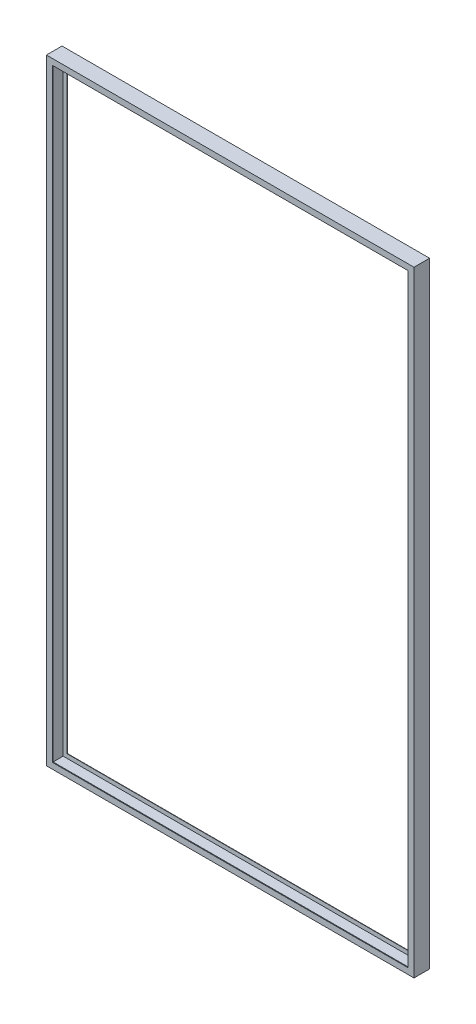
ISO-10303-21;
HEADER;
FILE_DESCRIPTION(('STEP AP214'),'2;1');
FILE_NAME('part.step','',(''),(''),'','','');
FILE_SCHEMA(('AUTOMOTIVE_DESIGN { 1 0 10303 214 1 1 1 1 }'));
ENDSEC;
DATA;
#1=APPLICATION_CONTEXT('core data for automotive mechanical design processes');
#2=APPLICATION_PROTOCOL_DEFINITION('international standard','automotive_design',2000,#1);
#3=PRODUCT_CONTEXT('',#1,'mechanical');
#4=PRODUCT('Part','Part','',(#3));
#5=PRODUCT_RELATED_PRODUCT_CATEGORY('part','',(#4));
#6=PRODUCT_DEFINITION_FORMATION('','',#4);
#7=PRODUCT_DEFINITION_CONTEXT('part definition',#1,'design');
#8=PRODUCT_DEFINITION('design','',#6,#7);
#9=PRODUCT_DEFINITION_SHAPE('','',#8);
#10=(LENGTH_UNIT() NAMED_UNIT(*) SI_UNIT(.MILLI.,.METRE.));
#11=(NAMED_UNIT(*) PLANE_ANGLE_UNIT() SI_UNIT($,.RADIAN.));
#12=(NAMED_UNIT(*) SI_UNIT($,.STERADIAN.) SOLID_ANGLE_UNIT());
#13=UNCERTAINTY_MEASURE_WITH_UNIT(LENGTH_MEASURE(1.E-05),#10,'distance_accuracy_value','');
#14=(GEOMETRIC_REPRESENTATION_CONTEXT(3) GLOBAL_UNCERTAINTY_ASSIGNED_CONTEXT((#13)) GLOBAL_UNIT_ASSIGNED_CONTEXT((#10,
#11,#12)) REPRESENTATION_CONTEXT('',''));
#15=CARTESIAN_POINT('',(0.,0.,0.));
#16=DIRECTION('',(0.,0.,1.));
#17=DIRECTION('',(1.,0.,0.));
#18=AXIS2_PLACEMENT_3D('',#15,#16,#17);
#19=CARTESIAN_POINT('',(979.,1647.,0.));
#20=DIRECTION('',(0.,1.,0.));
#21=DIRECTION('',(0.,0.,1.));
#22=AXIS2_PLACEMENT_3D('',#19,#20,#21);
#23=PLANE('',#22);
#24=DIRECTION('',(0.,0.,1.));
#25=VECTOR('',#24,1.);
#26=CARTESIAN_POINT('',(11.,1647.,0.));
#27=LINE('',#26,#25);
#28=CARTESIAN_POINT('',(11.,1647.,3.));
#29=VERTEX_POINT('',#28);
#30=CARTESIAN_POINT('',(11.,1647.,4.));
#31=VERTEX_POINT('',#30);
#32=EDGE_CURVE('E362',#29,#31,#27,.T.);
#33=ORIENTED_EDGE('',*,*,#32,.F.);
#34=DIRECTION('',(1.,0.,0.));
#35=VECTOR('',#34,1.);
#36=CARTESIAN_POINT('',(979.,1647.,3.));
#37=LINE('',#36,#35);
#38=CARTESIAN_POINT('',(979.,1647.,3.));
#39=VERTEX_POINT('',#38);
#40=EDGE_CURVE('E11',#29,#39,#37,.T.);
#41=ORIENTED_EDGE('',*,*,#40,.T.);
#42=DIRECTION('',(0.,0.,1.));
#43=VECTOR('',#42,1.);
#44=CARTESIAN_POINT('',(979.,1647.,0.));
#45=LINE('',#44,#43);
#46=CARTESIAN_POINT('',(979.,1647.,4.));
#47=VERTEX_POINT('',#46);
#48=EDGE_CURVE('E349',#39,#47,#45,.T.);
#49=ORIENTED_EDGE('',*,*,#48,.T.);
#50=DIRECTION('',(-1.,0.,0.));
#51=VECTOR('',#50,1.);
#52=CARTESIAN_POINT('',(979.,1647.,4.));
#53=LINE('',#52,#51);
#54=EDGE_CURVE('E273',#47,#31,#53,.T.);
#55=ORIENTED_EDGE('',*,*,#54,.T.);
#56=EDGE_LOOP('',(#33,#41,#49,#55));
#57=FACE_BOUND('',#56,.T.);
#58=ADVANCED_FACE('F40',(#57),#23,.F.);
#59=CARTESIAN_POINT('',(979.,11.,0.));
#60=DIRECTION('',(1.,0.,0.));
#61=DIRECTION('',(0.,0.,-1.));
#62=AXIS2_PLACEMENT_3D('',#59,#60,#61);
#63=PLANE('',#62);
#64=ORIENTED_EDGE('',*,*,#48,.F.);
#65=DIRECTION('',(0.,-1.,0.));
#66=VECTOR('',#65,1.);
#67=CARTESIAN_POINT('',(979.,11.,3.));
#68=LINE('',#67,#66);
#69=CARTESIAN_POINT('',(979.,11.,3.));
#70=VERTEX_POINT('',#69);
#71=EDGE_CURVE('E463',#39,#70,#68,.T.);
#72=ORIENTED_EDGE('',*,*,#71,.T.);
#73=DIRECTION('',(0.,0.,1.));
#74=VECTOR('',#73,1.);
#75=CARTESIAN_POINT('',(979.,11.,0.));
#76=LINE('',#75,#74);
#77=CARTESIAN_POINT('',(979.,11.,4.));
#78=VERTEX_POINT('',#77);
#79=EDGE_CURVE('E354',#70,#78,#76,.T.);
#80=ORIENTED_EDGE('',*,*,#79,.T.);
#81=DIRECTION('',(0.,1.,0.));
#82=VECTOR('',#81,1.);
#83=CARTESIAN_POINT('',(979.,11.,4.));
#84=LINE('',#83,#82);
#85=EDGE_CURVE('E269',#78,#47,#84,.T.);
#86=ORIENTED_EDGE('',*,*,#85,.T.);
#87=EDGE_LOOP('',(#64,#72,#80,#86));
#88=FACE_BOUND('',#87,.T.);
#89=ADVANCED_FACE('F519',(#88),#63,.F.);
#90=CARTESIAN_POINT('',(11.,11.,0.));
#91=DIRECTION('',(0.,-1.,0.));
#92=DIRECTION('',(0.,0.,-1.));
#93=AXIS2_PLACEMENT_3D('',#90,#91,#92);
#94=PLANE('',#93);
#95=ORIENTED_EDGE('',*,*,#79,.F.);
#96=DIRECTION('',(-1.,0.,0.));
#97=VECTOR('',#96,1.);
#98=CARTESIAN_POINT('',(11.,11.,3.));
#99=LINE('',#98,#97);
#100=CARTESIAN_POINT('',(11.,11.,3.));
#101=VERTEX_POINT('',#100);
#102=EDGE_CURVE('E66',#70,#101,#99,.T.);
#103=ORIENTED_EDGE('',*,*,#102,.T.);
#104=DIRECTION('',(0.,0.,1.));
#105=VECTOR('',#104,1.);
#106=CARTESIAN_POINT('',(11.,11.,0.));
#107=LINE('',#106,#105);
#108=CARTESIAN_POINT('',(11.,11.,4.));
#109=VERTEX_POINT('',#108);
#110=EDGE_CURVE('E358',#101,#109,#107,.T.);
#111=ORIENTED_EDGE('',*,*,#110,.T.);
#112=DIRECTION('',(1.,0.,0.));
#113=VECTOR('',#112,1.);
#114=CARTESIAN_POINT('',(11.,11.,4.));
#115=LINE('',#114,#113);
#116=EDGE_CURVE('E265',#109,#78,#115,.T.);
#117=ORIENTED_EDGE('',*,*,#116,.T.);
#118=EDGE_LOOP('',(#95,#103,#111,#117));
#119=FACE_BOUND('',#118,.T.);
#120=ADVANCED_FACE('F526',(#119),#94,.F.);
#121=CARTESIAN_POINT('',(11.,1647.,0.));
#122=DIRECTION('',(-1.,0.,0.));
#123=DIRECTION('',(0.,0.,1.));
#124=AXIS2_PLACEMENT_3D('',#121,#122,#123);
#125=PLANE('',#124);
#126=ORIENTED_EDGE('',*,*,#110,.F.);
#127=DIRECTION('',(0.,1.,0.));
#128=VECTOR('',#127,1.);
#129=CARTESIAN_POINT('',(11.,1647.,3.));
#130=LINE('',#129,#128);
#131=EDGE_CURVE('E51',#101,#29,#130,.T.);
#132=ORIENTED_EDGE('',*,*,#131,.T.);
#133=ORIENTED_EDGE('',*,*,#32,.T.);
#134=DIRECTION('',(0.,-1.,0.));
#135=VECTOR('',#134,1.);
#136=CARTESIAN_POINT('',(11.,1647.,4.));
#137=LINE('',#136,#135);
#138=EDGE_CURVE('E446',#31,#109,#137,.T.);
#139=ORIENTED_EDGE('',*,*,#138,.T.);
#140=EDGE_LOOP('',(#126,#132,#133,#139));
#141=FACE_BOUND('',#140,.T.);
#142=ADVANCED_FACE('F680',(#141),#125,.F.);
#143=CARTESIAN_POINT('',(0.,0.,42.));
#144=DIRECTION('',(1.,0.,0.));
#145=DIRECTION('',(0.,0.,-1.));
#146=AXIS2_PLACEMENT_3D('',#143,#144,#145);
#147=PLANE('',#146);
#148=DIRECTION('',(0.,-1.,0.));
#149=VECTOR('',#148,1.);
#150=CARTESIAN_POINT('',(0.,0.,0.));
#151=LINE('',#150,#149);
#152=CARTESIAN_POINT('',(0.,1658.,0.));
#153=VERTEX_POINT('',#152);
#154=CARTESIAN_POINT('',(0.,0.,0.));
#155=VERTEX_POINT('',#154);
#156=EDGE_CURVE('E395',#153,#155,#151,.T.);
#157=ORIENTED_EDGE('',*,*,#156,.T.);
#158=DIRECTION('',(0.,0.,-1.));
#159=VECTOR('',#158,1.);
#160=CARTESIAN_POINT('',(0.,0.,42.));
#161=LINE('',#160,#159);
#162=CARTESIAN_POINT('',(0.,0.,42.));
#163=VERTEX_POINT('',#162);
#164=EDGE_CURVE('E442',#163,#155,#161,.T.);
#165=ORIENTED_EDGE('',*,*,#164,.F.);
#166=DIRECTION('',(0.,-1.,0.));
#167=VECTOR('',#166,1.);
#168=CARTESIAN_POINT('',(0.,0.,42.));
#169=LINE('',#168,#167);
#170=CARTESIAN_POINT('',(0.,1658.,42.));
#171=VERTEX_POINT('',#170);
#172=EDGE_CURVE('E405',#171,#163,#169,.T.);
#173=ORIENTED_EDGE('',*,*,#172,.F.);
#174=DIRECTION('',(0.,0.,-1.));
#175=VECTOR('',#174,1.);
#176=CARTESIAN_POINT('',(0.,1658.,42.));
#177=LINE('',#176,#175);
#178=EDGE_CURVE('E419',#171,#153,#177,.T.);
#179=ORIENTED_EDGE('',*,*,#178,.T.);
#180=EDGE_LOOP('',(#157,#165,#173,#179));
#181=FACE_BOUND('',#180,.T.);
#182=ADVANCED_FACE('F684',(#181),#147,.F.);
#183=CARTESIAN_POINT('',(0.,0.,42.));
#184=DIRECTION('',(0.,1.,0.));
#185=DIRECTION('',(0.,0.,1.));
#186=AXIS2_PLACEMENT_3D('',#183,#184,#185);
#187=PLANE('',#186);
#188=DIRECTION('',(1.,0.,0.));
#189=VECTOR('',#188,1.);
#190=CARTESIAN_POINT('',(0.,0.,0.));
#191=LINE('',#190,#189);
#192=CARTESIAN_POINT('',(990.,0.,0.));
#193=VERTEX_POINT('',#192);
#194=EDGE_CURVE('E423',#155,#193,#191,.T.);
#195=ORIENTED_EDGE('',*,*,#194,.T.);
#196=DIRECTION('',(0.,0.,-1.));
#197=VECTOR('',#196,1.);
#198=CARTESIAN_POINT('',(990.,0.,42.));
#199=LINE('',#198,#197);
#200=CARTESIAN_POINT('',(990.,0.,42.));
#201=VERTEX_POINT('',#200);
#202=EDGE_CURVE('E438',#201,#193,#199,.T.);
#203=ORIENTED_EDGE('',*,*,#202,.F.);
#204=DIRECTION('',(1.,0.,0.));
#205=VECTOR('',#204,1.);
#206=CARTESIAN_POINT('',(0.,0.,42.));
#207=LINE('',#206,#205);
#208=EDGE_CURVE('E409',#163,#201,#207,.T.);
#209=ORIENTED_EDGE('',*,*,#208,.F.);
#210=ORIENTED_EDGE('',*,*,#164,.T.);
#211=EDGE_LOOP('',(#195,#203,#209,#210));
#212=FACE_BOUND('',#211,.T.);
#213=ADVANCED_FACE('F689',(#212),#187,.F.);
#214=CARTESIAN_POINT('',(990.,0.,42.));
#215=DIRECTION('',(-1.,0.,0.));
#216=DIRECTION('',(0.,0.,1.));
#217=AXIS2_PLACEMENT_3D('',#214,#215,#216);
#218=PLANE('',#217);
#219=DIRECTION('',(0.,1.,0.));
#220=VECTOR('',#219,1.);
#221=CARTESIAN_POINT('',(990.,0.,0.));
#222=LINE('',#221,#220);
#223=CARTESIAN_POINT('',(990.,1658.,0.));
#224=VERTEX_POINT('',#223);
#225=EDGE_CURVE('E426',#193,#224,#222,.T.);
#226=ORIENTED_EDGE('',*,*,#225,.T.);
#227=DIRECTION('',(0.,0.,-1.));
#228=VECTOR('',#227,1.);
#229=CARTESIAN_POINT('',(990.,1658.,42.));
#230=LINE('',#229,#228);
#231=CARTESIAN_POINT('',(990.,1658.,42.));
#232=VERTEX_POINT('',#231);
#233=EDGE_CURVE('E434',#232,#224,#230,.T.);
#234=ORIENTED_EDGE('',*,*,#233,.F.);
#235=DIRECTION('',(0.,1.,0.));
#236=VECTOR('',#235,1.);
#237=CARTESIAN_POINT('',(990.,0.,42.));
#238=LINE('',#237,#236);
#239=EDGE_CURVE('E413',#201,#232,#238,.T.);
#240=ORIENTED_EDGE('',*,*,#239,.F.);
#241=ORIENTED_EDGE('',*,*,#202,.T.);
#242=EDGE_LOOP('',(#226,#234,#240,#241));
#243=FACE_BOUND('',#242,.T.);
#244=ADVANCED_FACE('F724',(#243),#218,.F.);
#245=CARTESIAN_POINT('',(0.,1658.,42.));
#246=DIRECTION('',(0.,-1.,0.));
#247=DIRECTION('',(0.,0.,-1.));
#248=AXIS2_PLACEMENT_3D('',#245,#246,#247);
#249=PLANE('',#248);
#250=DIRECTION('',(-1.,0.,0.));
#251=VECTOR('',#250,1.);
#252=CARTESIAN_POINT('',(0.,1658.,0.));
#253=LINE('',#252,#251);
#254=EDGE_CURVE('E410',#224,#153,#253,.T.);
#255=ORIENTED_EDGE('',*,*,#254,.T.);
#256=ORIENTED_EDGE('',*,*,#178,.F.);
#257=DIRECTION('',(-1.,0.,0.));
#258=VECTOR('',#257,1.);
#259=CARTESIAN_POINT('',(0.,1658.,42.));
#260=LINE('',#259,#258);
#261=EDGE_CURVE('E416',#232,#171,#260,.T.);
#262=ORIENTED_EDGE('',*,*,#261,.F.);
#263=ORIENTED_EDGE('',*,*,#233,.T.);
#264=EDGE_LOOP('',(#255,#256,#262,#263));
#265=FACE_BOUND('',#264,.T.);
#266=ADVANCED_FACE('F728',(#265),#249,.F.);
#267=CARTESIAN_POINT('',(0.,0.,42.));
#268=DIRECTION('',(0.,0.,-1.));
#269=DIRECTION('',(-1.,0.,0.));
#270=AXIS2_PLACEMENT_3D('',#267,#268,#269);
#271=PLANE('',#270);
#272=DIRECTION('',(1.,0.,0.));
#273=VECTOR('',#272,1.);
#274=CARTESIAN_POINT('',(16.,16.,42.));
#275=LINE('',#274,#273);
#276=CARTESIAN_POINT('',(16.,16.,42.));
#277=VERTEX_POINT('',#276);
#278=CARTESIAN_POINT('',(974.,16.,42.));
#279=VERTEX_POINT('',#278);
#280=EDGE_CURVE('E381',#277,#279,#275,.T.);
#281=ORIENTED_EDGE('',*,*,#280,.F.);
#282=DIRECTION('',(0.,-1.,0.));
#283=VECTOR('',#282,1.);
#284=CARTESIAN_POINT('',(16.,1642.,42.));
#285=LINE('',#284,#283);
#286=CARTESIAN_POINT('',(16.,1642.,42.));
#287=VERTEX_POINT('',#286);
#288=EDGE_CURVE('E352',#287,#277,#285,.T.);
#289=ORIENTED_EDGE('',*,*,#288,.F.);
#290=DIRECTION('',(-1.,0.,0.));
#291=VECTOR('',#290,1.);
#292=CARTESIAN_POINT('',(974.,1642.,42.));
#293=LINE('',#292,#291);
#294=CARTESIAN_POINT('',(974.,1642.,42.));
#295=VERTEX_POINT('',#294);
#296=EDGE_CURVE('E369',#295,#287,#293,.T.);
#297=ORIENTED_EDGE('',*,*,#296,.F.);
#298=DIRECTION('',(0.,1.,0.));
#299=VECTOR('',#298,1.);
#300=CARTESIAN_POINT('',(974.,16.,42.));
#301=LINE('',#300,#299);
#302=EDGE_CURVE('E385',#279,#295,#301,.T.);
#303=ORIENTED_EDGE('',*,*,#302,.F.);
#304=EDGE_LOOP('',(#281,#289,#297,#303));
#305=FACE_BOUND('',#304,.T.);
#306=ORIENTED_EDGE('',*,*,#172,.T.);
#307=ORIENTED_EDGE('',*,*,#208,.T.);
#308=ORIENTED_EDGE('',*,*,#239,.T.);
#309=ORIENTED_EDGE('',*,*,#261,.T.);
#310=EDGE_LOOP('',(#306,#307,#308,#309));
#311=FACE_BOUND('',#310,.T.);
#312=ADVANCED_FACE('F732',(#305,#311),#271,.F.);
#313=CARTESIAN_POINT('',(0.,0.,0.));
#314=DIRECTION('',(0.,0.,-1.));
#315=DIRECTION('',(-1.,0.,0.));
#316=AXIS2_PLACEMENT_3D('',#313,#314,#315);
#317=PLANE('',#316);
#318=DIRECTION('',(1.,0.,0.));
#319=VECTOR('',#318,1.);
#320=CARTESIAN_POINT('',(979.,5.80384757729334,0.));
#321=LINE('',#320,#319);
#322=CARTESIAN_POINT('',(5.80384757729334,5.80384757729334,0.));
#323=VERTEX_POINT('',#322);
#324=CARTESIAN_POINT('',(984.196152422707,5.80384757729334,0.));
#325=VERTEX_POINT('',#324);
#326=EDGE_CURVE('E456',#323,#325,#321,.T.);
#327=ORIENTED_EDGE('',*,*,#326,.T.);
#328=DIRECTION('',(0.,1.,0.));
#329=VECTOR('',#328,1.);
#330=CARTESIAN_POINT('',(984.196152422707,1647.,0.));
#331=LINE('',#330,#329);
#332=CARTESIAN_POINT('',(984.196152422707,1652.19615242271,0.));
#333=VERTEX_POINT('',#332);
#334=EDGE_CURVE('E459',#325,#333,#331,.T.);
#335=ORIENTED_EDGE('',*,*,#334,.T.);
#336=DIRECTION('',(-1.,0.,0.));
#337=VECTOR('',#336,1.);
#338=CARTESIAN_POINT('',(11.,1652.19615242271,0.));
#339=LINE('',#338,#337);
#340=CARTESIAN_POINT('',(5.80384757729334,1652.19615242271,0.));
#341=VERTEX_POINT('',#340);
#342=EDGE_CURVE('E450',#333,#341,#339,.T.);
#343=ORIENTED_EDGE('',*,*,#342,.T.);
#344=DIRECTION('',(0.,-1.,0.));
#345=VECTOR('',#344,1.);
#346=CARTESIAN_POINT('',(5.80384757729334,11.,0.));
#347=LINE('',#346,#345);
#348=EDGE_CURVE('E453',#341,#323,#347,.T.);
#349=ORIENTED_EDGE('',*,*,#348,.T.);
#350=EDGE_LOOP('',(#327,#335,#343,#349));
#351=FACE_BOUND('',#350,.T.);
#352=ORIENTED_EDGE('',*,*,#156,.F.);
#353=ORIENTED_EDGE('',*,*,#254,.F.);
#354=ORIENTED_EDGE('',*,*,#225,.F.);
#355=ORIENTED_EDGE('',*,*,#194,.F.);
#356=EDGE_LOOP('',(#352,#353,#354,#355));
#357=FACE_BOUND('',#356,.T.);
#358=ADVANCED_FACE('F734',(#351,#357),#317,.T.);
#359=CARTESIAN_POINT('',(16.,1642.,40.));
#360=DIRECTION('',(-1.,0.,0.));
#361=DIRECTION('',(0.,0.,1.));
#362=AXIS2_PLACEMENT_3D('',#359,#360,#361);
#363=PLANE('',#362);
#364=ORIENTED_EDGE('',*,*,#288,.T.);
#365=DIRECTION('',(0.,0.,1.));
#366=VECTOR('',#365,1.);
#367=CARTESIAN_POINT('',(16.,16.,40.));
#368=LINE('',#367,#366);
#369=CARTESIAN_POINT('',(16.,16.,40.));
#370=VERTEX_POINT('',#369);
#371=EDGE_CURVE('E378',#370,#277,#368,.T.);
#372=ORIENTED_EDGE('',*,*,#371,.F.);
#373=DIRECTION('',(0.,-1.,0.));
#374=VECTOR('',#373,1.);
#375=CARTESIAN_POINT('',(16.,1642.,40.));
#376=LINE('',#375,#374);
#377=CARTESIAN_POINT('',(16.,1642.,40.));
#378=VERTEX_POINT('',#377);
#379=EDGE_CURVE('E365',#378,#370,#376,.T.);
#380=ORIENTED_EDGE('',*,*,#379,.F.);
#381=DIRECTION('',(0.,0.,1.));
#382=VECTOR('',#381,1.);
#383=CARTESIAN_POINT('',(16.,1642.,40.));
#384=LINE('',#383,#382);
#385=EDGE_CURVE('E392',#378,#287,#384,.T.);
#386=ORIENTED_EDGE('',*,*,#385,.T.);
#387=EDGE_LOOP('',(#364,#372,#380,#386));
#388=FACE_BOUND('',#387,.T.);
#389=ADVANCED_FACE('F737',(#388),#363,.F.);
#390=CARTESIAN_POINT('',(974.,1642.,40.));
#391=DIRECTION('',(0.,1.,0.));
#392=DIRECTION('',(0.,0.,1.));
#393=AXIS2_PLACEMENT_3D('',#390,#391,#392);
#394=PLANE('',#393);
#395=ORIENTED_EDGE('',*,*,#296,.T.);
#396=ORIENTED_EDGE('',*,*,#385,.F.);
#397=DIRECTION('',(-1.,0.,0.));
#398=VECTOR('',#397,1.);
#399=CARTESIAN_POINT('',(974.,1642.,40.));
#400=LINE('',#399,#398);
#401=CARTESIAN_POINT('',(974.,1642.,40.));
#402=VERTEX_POINT('',#401);
#403=EDGE_CURVE('E375',#402,#378,#400,.T.);
#404=ORIENTED_EDGE('',*,*,#403,.F.);
#405=DIRECTION('',(0.,0.,1.));
#406=VECTOR('',#405,1.);
#407=CARTESIAN_POINT('',(974.,1642.,40.));
#408=LINE('',#407,#406);
#409=EDGE_CURVE('E396',#402,#295,#408,.T.);
#410=ORIENTED_EDGE('',*,*,#409,.T.);
#411=EDGE_LOOP('',(#395,#396,#404,#410));
#412=FACE_BOUND('',#411,.T.);
#413=ADVANCED_FACE('F743',(#412),#394,.F.);
#414=CARTESIAN_POINT('',(974.,16.,40.));
#415=DIRECTION('',(1.,0.,0.));
#416=DIRECTION('',(0.,0.,-1.));
#417=AXIS2_PLACEMENT_3D('',#414,#415,#416);
#418=PLANE('',#417);
#419=ORIENTED_EDGE('',*,*,#302,.T.);
#420=ORIENTED_EDGE('',*,*,#409,.F.);
#421=DIRECTION('',(0.,1.,0.));
#422=VECTOR('',#421,1.);
#423=CARTESIAN_POINT('',(974.,16.,40.));
#424=LINE('',#423,#422);
#425=CARTESIAN_POINT('',(974.,16.,40.));
#426=VERTEX_POINT('',#425);
#427=EDGE_CURVE('E372',#426,#402,#424,.T.);
#428=ORIENTED_EDGE('',*,*,#427,.F.);
#429=DIRECTION('',(0.,0.,1.));
#430=VECTOR('',#429,1.);
#431=CARTESIAN_POINT('',(974.,16.,40.));
#432=LINE('',#431,#430);
#433=EDGE_CURVE('E399',#426,#279,#432,.T.);
#434=ORIENTED_EDGE('',*,*,#433,.T.);
#435=EDGE_LOOP('',(#419,#420,#428,#434));
#436=FACE_BOUND('',#435,.T.);
#437=ADVANCED_FACE('F541',(#436),#418,.F.);
#438=CARTESIAN_POINT('',(16.,16.,40.));
#439=DIRECTION('',(0.,-1.,0.));
#440=DIRECTION('',(0.,0.,-1.));
#441=AXIS2_PLACEMENT_3D('',#438,#439,#440);
#442=PLANE('',#441);
#443=ORIENTED_EDGE('',*,*,#280,.T.);
#444=ORIENTED_EDGE('',*,*,#433,.F.);
#445=DIRECTION('',(1.,0.,0.));
#446=VECTOR('',#445,1.);
#447=CARTESIAN_POINT('',(16.,16.,40.));
#448=LINE('',#447,#446);
#449=EDGE_CURVE('E368',#370,#426,#448,.T.);
#450=ORIENTED_EDGE('',*,*,#449,.F.);
#451=ORIENTED_EDGE('',*,*,#371,.T.);
#452=EDGE_LOOP('',(#443,#444,#450,#451));
#453=FACE_BOUND('',#452,.T.);
#454=ADVANCED_FACE('F533',(#453),#442,.F.);
#455=CARTESIAN_POINT('',(11.,1647.,8.));
#456=VERTEX_POINT('',#455);
#457=CARTESIAN_POINT('',(11.,1647.,40.));
#458=VERTEX_POINT('',#457);
#459=EDGE_CURVE('E348',#456,#458,#27,.T.);
#460=ORIENTED_EDGE('',*,*,#459,.F.);
#461=DIRECTION('',(-1.,0.,0.));
#462=VECTOR('',#461,1.);
#463=CARTESIAN_POINT('',(979.,1647.,8.));
#464=LINE('',#463,#462);
#465=CARTESIAN_POINT('',(979.,1647.,8.));
#466=VERTEX_POINT('',#465);
#467=EDGE_CURVE('E323',#466,#456,#464,.T.);
#468=ORIENTED_EDGE('',*,*,#467,.F.);
#469=CARTESIAN_POINT('',(979.,1647.,40.));
#470=VERTEX_POINT('',#469);
#471=EDGE_CURVE('E353',#466,#470,#45,.T.);
#472=ORIENTED_EDGE('',*,*,#471,.T.);
#473=DIRECTION('',(-1.,0.,0.));
#474=VECTOR('',#473,1.);
#475=CARTESIAN_POINT('',(979.,1647.,40.));
#476=LINE('',#475,#474);
#477=EDGE_CURVE('E332',#470,#458,#476,.T.);
#478=ORIENTED_EDGE('',*,*,#477,.T.);
#479=EDGE_LOOP('',(#460,#468,#472,#478));
#480=FACE_BOUND('',#479,.T.);
#481=ADVANCED_FACE('F522',(#480),#23,.F.);
#482=ORIENTED_EDGE('',*,*,#471,.F.);
#483=DIRECTION('',(0.,1.,0.));
#484=VECTOR('',#483,1.);
#485=CARTESIAN_POINT('',(979.,11.,8.));
#486=LINE('',#485,#484);
#487=CARTESIAN_POINT('',(979.,11.,8.));
#488=VERTEX_POINT('',#487);
#489=EDGE_CURVE('E320',#488,#466,#486,.T.);
#490=ORIENTED_EDGE('',*,*,#489,.F.);
#491=CARTESIAN_POINT('',(979.,11.,40.));
#492=VERTEX_POINT('',#491);
#493=EDGE_CURVE('E357',#488,#492,#76,.T.);
#494=ORIENTED_EDGE('',*,*,#493,.T.);
#495=DIRECTION('',(0.,1.,0.));
#496=VECTOR('',#495,1.);
#497=CARTESIAN_POINT('',(979.,11.,40.));
#498=LINE('',#497,#496);
#499=EDGE_CURVE('E344',#492,#470,#498,.T.);
#500=ORIENTED_EDGE('',*,*,#499,.T.);
#501=EDGE_LOOP('',(#482,#490,#494,#500));
#502=FACE_BOUND('',#501,.T.);
#503=ADVANCED_FACE('F529',(#502),#63,.F.);
#504=ORIENTED_EDGE('',*,*,#493,.F.);
#505=DIRECTION('',(1.,0.,0.));
#506=VECTOR('',#505,1.);
#507=CARTESIAN_POINT('',(11.,11.,8.));
#508=LINE('',#507,#506);
#509=CARTESIAN_POINT('',(11.,11.,8.));
#510=VERTEX_POINT('',#509);
#511=EDGE_CURVE('E329',#510,#488,#508,.T.);
#512=ORIENTED_EDGE('',*,*,#511,.F.);
#513=CARTESIAN_POINT('',(11.,11.,40.));
#514=VERTEX_POINT('',#513);
#515=EDGE_CURVE('E361',#510,#514,#107,.T.);
#516=ORIENTED_EDGE('',*,*,#515,.T.);
#517=DIRECTION('',(1.,0.,0.));
#518=VECTOR('',#517,1.);
#519=CARTESIAN_POINT('',(11.,11.,40.));
#520=LINE('',#519,#518);
#521=EDGE_CURVE('E340',#514,#492,#520,.T.);
#522=ORIENTED_EDGE('',*,*,#521,.T.);
#523=EDGE_LOOP('',(#504,#512,#516,#522));
#524=FACE_BOUND('',#523,.T.);
#525=ADVANCED_FACE('F539',(#524),#94,.F.);
#526=ORIENTED_EDGE('',*,*,#515,.F.);
#527=DIRECTION('',(0.,-1.,0.));
#528=VECTOR('',#527,1.);
#529=CARTESIAN_POINT('',(11.,1647.,8.));
#530=LINE('',#529,#528);
#531=EDGE_CURVE('E326',#456,#510,#530,.T.);
#532=ORIENTED_EDGE('',*,*,#531,.F.);
#533=ORIENTED_EDGE('',*,*,#459,.T.);
#534=DIRECTION('',(0.,-1.,0.));
#535=VECTOR('',#534,1.);
#536=CARTESIAN_POINT('',(11.,1647.,40.));
#537=LINE('',#536,#535);
#538=EDGE_CURVE('E336',#458,#514,#537,.T.);
#539=ORIENTED_EDGE('',*,*,#538,.T.);
#540=EDGE_LOOP('',(#526,#532,#533,#539));
#541=FACE_BOUND('',#540,.T.);
#542=ADVANCED_FACE('F635',(#541),#125,.F.);
#543=CARTESIAN_POINT('',(0.,0.,40.));
#544=DIRECTION('',(0.,0.,1.));
#545=DIRECTION('',(1.,0.,0.));
#546=AXIS2_PLACEMENT_3D('',#543,#544,#545);
#547=PLANE('',#546);
#548=ORIENTED_EDGE('',*,*,#379,.T.);
#549=ORIENTED_EDGE('',*,*,#449,.T.);
#550=ORIENTED_EDGE('',*,*,#427,.T.);
#551=ORIENTED_EDGE('',*,*,#403,.T.);
#552=EDGE_LOOP('',(#548,#549,#550,#551));
#553=FACE_BOUND('',#552,.T.);
#554=ORIENTED_EDGE('',*,*,#477,.F.);
#555=ORIENTED_EDGE('',*,*,#499,.F.);
#556=ORIENTED_EDGE('',*,*,#521,.F.);
#557=ORIENTED_EDGE('',*,*,#538,.F.);
#558=EDGE_LOOP('',(#554,#555,#556,#557));
#559=FACE_BOUND('',#558,.T.);
#560=ADVANCED_FACE('F629',(#553,#559),#547,.F.);
#561=CARTESIAN_POINT('',(0.,0.,8.));
#562=DIRECTION('',(0.,0.,1.));
#563=DIRECTION('',(1.,0.,0.));
#564=AXIS2_PLACEMENT_3D('',#561,#562,#563);
#565=PLANE('',#564);
#566=ORIENTED_EDGE('',*,*,#489,.T.);
#567=ORIENTED_EDGE('',*,*,#467,.T.);
#568=ORIENTED_EDGE('',*,*,#531,.T.);
#569=ORIENTED_EDGE('',*,*,#511,.T.);
#570=EDGE_LOOP('',(#566,#567,#568,#569));
#571=FACE_BOUND('',#570,.T.);
#572=DIRECTION('',(0.,-1.,0.));
#573=VECTOR('',#572,1.);
#574=CARTESIAN_POINT('',(22.,1636.,8.));
#575=LINE('',#574,#573);
#576=CARTESIAN_POINT('',(22.,1636.,8.));
#577=VERTEX_POINT('',#576);
#578=CARTESIAN_POINT('',(22.,22.,8.));
#579=VERTEX_POINT('',#578);
#580=EDGE_CURVE('E281',#577,#579,#575,.T.);
#581=ORIENTED_EDGE('',*,*,#580,.F.);
#582=DIRECTION('',(-1.,0.,0.));
#583=VECTOR('',#582,1.);
#584=CARTESIAN_POINT('',(968.,1636.,8.));
#585=LINE('',#584,#583);
#586=CARTESIAN_POINT('',(968.,1636.,8.));
#587=VERTEX_POINT('',#586);
#588=EDGE_CURVE('E278',#587,#577,#585,.T.);
#589=ORIENTED_EDGE('',*,*,#588,.F.);
#590=DIRECTION('',(0.,1.,0.));
#591=VECTOR('',#590,1.);
#592=CARTESIAN_POINT('',(968.,22.,8.));
#593=LINE('',#592,#591);
#594=CARTESIAN_POINT('',(968.,22.,8.));
#595=VERTEX_POINT('',#594);
#596=EDGE_CURVE('E289',#595,#587,#593,.T.);
#597=ORIENTED_EDGE('',*,*,#596,.F.);
#598=DIRECTION('',(1.,0.,0.));
#599=VECTOR('',#598,1.);
#600=CARTESIAN_POINT('',(22.,22.,8.));
#601=LINE('',#600,#599);
#602=EDGE_CURVE('E285',#579,#595,#601,.T.);
#603=ORIENTED_EDGE('',*,*,#602,.F.);
#604=EDGE_LOOP('',(#581,#589,#597,#603));
#605=FACE_BOUND('',#604,.T.);
#606=ADVANCED_FACE('F637',(#571,#605),#565,.T.);
#607=CARTESIAN_POINT('',(0.,0.,7.));
#608=DIRECTION('',(0.,0.,1.));
#609=DIRECTION('',(1.,0.,0.));
#610=AXIS2_PLACEMENT_3D('',#607,#608,#609);
#611=PLANE('',#610);
#612=DIRECTION('',(-1.,0.,0.));
#613=VECTOR('',#612,1.);
#614=CARTESIAN_POINT('',(968.,1636.,7.));
#615=LINE('',#614,#613);
#616=CARTESIAN_POINT('',(968.,1636.,7.));
#617=VERTEX_POINT('',#616);
#618=CARTESIAN_POINT('',(22.,1636.,7.));
#619=VERTEX_POINT('',#618);
#620=EDGE_CURVE('E277',#617,#619,#615,.T.);
#621=ORIENTED_EDGE('',*,*,#620,.T.);
#622=DIRECTION('',(0.,-1.,0.));
#623=VECTOR('',#622,1.);
#624=CARTESIAN_POINT('',(22.,1636.,7.));
#625=LINE('',#624,#623);
#626=CARTESIAN_POINT('',(22.,22.,7.));
#627=VERTEX_POINT('',#626);
#628=EDGE_CURVE('E296',#619,#627,#625,.T.);
#629=ORIENTED_EDGE('',*,*,#628,.T.);
#630=DIRECTION('',(1.,0.,0.));
#631=VECTOR('',#630,1.);
#632=CARTESIAN_POINT('',(22.,22.,7.));
#633=LINE('',#632,#631);
#634=CARTESIAN_POINT('',(968.,22.,7.));
#635=VERTEX_POINT('',#634);
#636=EDGE_CURVE('E300',#627,#635,#633,.T.);
#637=ORIENTED_EDGE('',*,*,#636,.T.);
#638=DIRECTION('',(0.,1.,0.));
#639=VECTOR('',#638,1.);
#640=CARTESIAN_POINT('',(968.,22.,7.));
#641=LINE('',#640,#639);
#642=EDGE_CURVE('E282',#635,#617,#641,.T.);
#643=ORIENTED_EDGE('',*,*,#642,.T.);
#644=EDGE_LOOP('',(#621,#629,#637,#643));
#645=FACE_BOUND('',#644,.T.);
#646=DIRECTION('',(-1.,0.,0.));
#647=VECTOR('',#646,1.);
#648=CARTESIAN_POINT('',(985.,5.,6.9999999999999));
#649=LINE('',#648,#647);
#650=CARTESIAN_POINT('',(985.,4.99999999999989,6.9999999999999));
#651=VERTEX_POINT('',#650);
#652=CARTESIAN_POINT('',(5.,5.,6.9999999999999));
#653=VERTEX_POINT('',#652);
#654=EDGE_CURVE('E238',#651,#653,#649,.T.);
#655=ORIENTED_EDGE('',*,*,#654,.T.);
#656=DIRECTION('',(0.,1.,0.));
#657=VECTOR('',#656,1.);
#658=CARTESIAN_POINT('',(5.,5.,6.9999999999999));
#659=LINE('',#658,#657);
#660=CARTESIAN_POINT('',(5.,1653.,7.00000000000034));
#661=VERTEX_POINT('',#660);
#662=EDGE_CURVE('E231',#653,#661,#659,.T.);
#663=ORIENTED_EDGE('',*,*,#662,.T.);
#664=DIRECTION('',(1.,0.,0.));
#665=VECTOR('',#664,1.);
#666=CARTESIAN_POINT('',(5.,1653.,6.9999999999999));
#667=LINE('',#666,#665);
#668=CARTESIAN_POINT('',(985.,1653.,6.9999999999999));
#669=VERTEX_POINT('',#668);
#670=EDGE_CURVE('E216',#661,#669,#667,.T.);
#671=ORIENTED_EDGE('',*,*,#670,.T.);
#672=DIRECTION('',(0.,-1.,0.));
#673=VECTOR('',#672,1.);
#674=CARTESIAN_POINT('',(985.,1653.,6.9999999999999));
#675=LINE('',#674,#673);
#676=EDGE_CURVE('E256',#669,#651,#675,.T.);
#677=ORIENTED_EDGE('',*,*,#676,.T.);
#678=EDGE_LOOP('',(#655,#663,#671,#677));
#679=FACE_BOUND('',#678,.T.);
#680=ADVANCED_FACE('F237',(#645,#679),#611,.F.);
#681=CARTESIAN_POINT('',(968.,1636.,8.));
#682=DIRECTION('',(0.,-1.,0.));
#683=DIRECTION('',(0.,0.,-1.));
#684=AXIS2_PLACEMENT_3D('',#681,#682,#683);
#685=PLANE('',#684);
#686=ORIENTED_EDGE('',*,*,#620,.F.);
#687=DIRECTION('',(0.,0.,-1.));
#688=VECTOR('',#687,1.);
#689=CARTESIAN_POINT('',(968.,1636.,8.));
#690=LINE('',#689,#688);
#691=EDGE_CURVE('E292',#587,#617,#690,.T.);
#692=ORIENTED_EDGE('',*,*,#691,.F.);
#693=ORIENTED_EDGE('',*,*,#588,.T.);
#694=DIRECTION('',(0.,0.,-1.));
#695=VECTOR('',#694,1.);
#696=CARTESIAN_POINT('',(22.,1636.,8.));
#697=LINE('',#696,#695);
#698=EDGE_CURVE('E316',#577,#619,#697,.T.);
#699=ORIENTED_EDGE('',*,*,#698,.T.);
#700=EDGE_LOOP('',(#686,#692,#693,#699));
#701=FACE_BOUND('',#700,.T.);
#702=ADVANCED_FACE('F655',(#701),#685,.T.);
#703=CARTESIAN_POINT('',(22.,1636.,8.));
#704=DIRECTION('',(1.,0.,0.));
#705=DIRECTION('',(0.,0.,-1.));
#706=AXIS2_PLACEMENT_3D('',#703,#704,#705);
#707=PLANE('',#706);
#708=ORIENTED_EDGE('',*,*,#628,.F.);
#709=ORIENTED_EDGE('',*,*,#698,.F.);
#710=ORIENTED_EDGE('',*,*,#580,.T.);
#711=DIRECTION('',(0.,0.,-1.));
#712=VECTOR('',#711,1.);
#713=CARTESIAN_POINT('',(22.,22.,8.));
#714=LINE('',#713,#712);
#715=EDGE_CURVE('E313',#579,#627,#714,.T.);
#716=ORIENTED_EDGE('',*,*,#715,.T.);
#717=EDGE_LOOP('',(#708,#709,#710,#716));
#718=FACE_BOUND('',#717,.T.);
#719=ADVANCED_FACE('F648',(#718),#707,.T.);
#720=CARTESIAN_POINT('',(22.,22.,8.));
#721=DIRECTION('',(0.,1.,0.));
#722=DIRECTION('',(0.,0.,1.));
#723=AXIS2_PLACEMENT_3D('',#720,#721,#722);
#724=PLANE('',#723);
#725=ORIENTED_EDGE('',*,*,#636,.F.);
#726=ORIENTED_EDGE('',*,*,#715,.F.);
#727=ORIENTED_EDGE('',*,*,#602,.T.);
#728=DIRECTION('',(0.,0.,-1.));
#729=VECTOR('',#728,1.);
#730=CARTESIAN_POINT('',(968.,22.,8.));
#731=LINE('',#730,#729);
#732=EDGE_CURVE('E310',#595,#635,#731,.T.);
#733=ORIENTED_EDGE('',*,*,#732,.T.);
#734=EDGE_LOOP('',(#725,#726,#727,#733));
#735=FACE_BOUND('',#734,.T.);
#736=ADVANCED_FACE('F651',(#735),#724,.T.);
#737=CARTESIAN_POINT('',(968.,22.,8.));
#738=DIRECTION('',(-1.,0.,0.));
#739=DIRECTION('',(0.,0.,1.));
#740=AXIS2_PLACEMENT_3D('',#737,#738,#739);
#741=PLANE('',#740);
#742=ORIENTED_EDGE('',*,*,#642,.F.);
#743=ORIENTED_EDGE('',*,*,#732,.F.);
#744=ORIENTED_EDGE('',*,*,#596,.T.);
#745=ORIENTED_EDGE('',*,*,#691,.T.);
#746=EDGE_LOOP('',(#742,#743,#744,#745));
#747=FACE_BOUND('',#746,.T.);
#748=ADVANCED_FACE('F658',(#747),#741,.T.);
#749=CARTESIAN_POINT('',(0.,0.,4.));
#750=DIRECTION('',(0.,0.,-1.));
#751=DIRECTION('',(-1.,0.,0.));
#752=AXIS2_PLACEMENT_3D('',#749,#750,#751);
#753=PLANE('',#752);
#754=DIRECTION('',(-1.,0.,0.));
#755=VECTOR('',#754,1.);
#756=CARTESIAN_POINT('',(985.,5.,4.));
#757=LINE('',#756,#755);
#758=CARTESIAN_POINT('',(985.,5.,4.));
#759=VERTEX_POINT('',#758);
#760=CARTESIAN_POINT('',(5.,5.,4.));
#761=VERTEX_POINT('',#760);
#762=EDGE_CURVE('E250',#759,#761,#757,.T.);
#763=ORIENTED_EDGE('',*,*,#762,.F.);
#764=DIRECTION('',(0.,-1.,0.));
#765=VECTOR('',#764,1.);
#766=CARTESIAN_POINT('',(985.,1653.,4.));
#767=LINE('',#766,#765);
#768=CARTESIAN_POINT('',(985.,1653.,4.));
#769=VERTEX_POINT('',#768);
#770=EDGE_CURVE('E241',#769,#759,#767,.T.);
#771=ORIENTED_EDGE('',*,*,#770,.F.);
#772=DIRECTION('',(1.,0.,0.));
#773=VECTOR('',#772,1.);
#774=CARTESIAN_POINT('',(5.,1653.,4.));
#775=LINE('',#774,#773);
#776=CARTESIAN_POINT('',(5.,1653.,4.));
#777=VERTEX_POINT('',#776);
#778=EDGE_CURVE('E246',#777,#769,#775,.T.);
#779=ORIENTED_EDGE('',*,*,#778,.F.);
#780=DIRECTION('',(0.,1.,0.));
#781=VECTOR('',#780,1.);
#782=CARTESIAN_POINT('',(5.,5.,4.));
#783=LINE('',#782,#781);
#784=EDGE_CURVE('E234',#761,#777,#783,.T.);
#785=ORIENTED_EDGE('',*,*,#784,.F.);
#786=EDGE_LOOP('',(#763,#771,#779,#785));
#787=FACE_BOUND('',#786,.T.);
#788=ORIENTED_EDGE('',*,*,#85,.F.);
#789=ORIENTED_EDGE('',*,*,#116,.F.);
#790=ORIENTED_EDGE('',*,*,#138,.F.);
#791=ORIENTED_EDGE('',*,*,#54,.F.);
#792=EDGE_LOOP('',(#788,#789,#790,#791));
#793=FACE_BOUND('',#792,.T.);
#794=ADVANCED_FACE('F502',(#787,#793),#753,.F.);
#795=CARTESIAN_POINT('',(5.,5.,1924.36903072935));
#796=DIRECTION('',(-1.,0.,0.));
#797=DIRECTION('',(0.,0.,1.));
#798=AXIS2_PLACEMENT_3D('',#795,#796,#797);
#799=PLANE('',#798);
#800=DIRECTION('',(0.,0.,-1.));
#801=VECTOR('',#800,1.);
#802=CARTESIAN_POINT('',(5.,5.,1924.36903072935));
#803=LINE('',#802,#801);
#804=EDGE_CURVE('E254',#653,#761,#803,.T.);
#805=ORIENTED_EDGE('',*,*,#804,.T.);
#806=ORIENTED_EDGE('',*,*,#784,.T.);
#807=DIRECTION('',(0.,0.,-1.));
#808=VECTOR('',#807,1.);
#809=CARTESIAN_POINT('',(5.,1653.,1924.36903072935));
#810=LINE('',#809,#808);
#811=EDGE_CURVE('E220',#661,#777,#810,.T.);
#812=ORIENTED_EDGE('',*,*,#811,.F.);
#813=ORIENTED_EDGE('',*,*,#662,.F.);
#814=EDGE_LOOP('',(#805,#806,#812,#813));
#815=FACE_BOUND('',#814,.T.);
#816=ADVANCED_FACE('F230',(#815),#799,.F.);
#817=CARTESIAN_POINT('',(5.,1653.,1924.36903072935));
#818=DIRECTION('',(0.,1.,0.));
#819=DIRECTION('',(0.,0.,1.));
#820=AXIS2_PLACEMENT_3D('',#817,#818,#819);
#821=PLANE('',#820);
#822=ORIENTED_EDGE('',*,*,#811,.T.);
#823=ORIENTED_EDGE('',*,*,#778,.T.);
#824=DIRECTION('',(0.,0.,-1.));
#825=VECTOR('',#824,1.);
#826=CARTESIAN_POINT('',(985.,1653.,1924.36903072935));
#827=LINE('',#826,#825);
#828=EDGE_CURVE('E222',#669,#769,#827,.T.);
#829=ORIENTED_EDGE('',*,*,#828,.F.);
#830=ORIENTED_EDGE('',*,*,#670,.F.);
#831=EDGE_LOOP('',(#822,#823,#829,#830));
#832=FACE_BOUND('',#831,.T.);
#833=ADVANCED_FACE('F218',(#832),#821,.F.);
#834=CARTESIAN_POINT('',(985.,1653.,1924.36903072935));
#835=DIRECTION('',(1.,0.,0.));
#836=DIRECTION('',(0.,0.,-1.));
#837=AXIS2_PLACEMENT_3D('',#834,#835,#836);
#838=PLANE('',#837);
#839=ORIENTED_EDGE('',*,*,#828,.T.);
#840=ORIENTED_EDGE('',*,*,#770,.T.);
#841=DIRECTION('',(0.,0.,-1.));
#842=VECTOR('',#841,1.);
#843=CARTESIAN_POINT('',(985.,5.,1924.36903072935));
#844=LINE('',#843,#842);
#845=EDGE_CURVE('E255',#651,#759,#844,.T.);
#846=ORIENTED_EDGE('',*,*,#845,.F.);
#847=ORIENTED_EDGE('',*,*,#676,.F.);
#848=EDGE_LOOP('',(#839,#840,#846,#847));
#849=FACE_BOUND('',#848,.T.);
#850=ADVANCED_FACE('F506',(#849),#838,.F.);
#851=CARTESIAN_POINT('',(985.,5.,1924.36903072935));
#852=DIRECTION('',(0.,-1.,0.));
#853=DIRECTION('',(0.,0.,-1.));
#854=AXIS2_PLACEMENT_3D('',#851,#852,#853);
#855=PLANE('',#854);
#856=ORIENTED_EDGE('',*,*,#845,.T.);
#857=ORIENTED_EDGE('',*,*,#762,.T.);
#858=ORIENTED_EDGE('',*,*,#804,.F.);
#859=ORIENTED_EDGE('',*,*,#654,.F.);
#860=EDGE_LOOP('',(#856,#857,#858,#859));
#861=FACE_BOUND('',#860,.T.);
#862=ADVANCED_FACE('F507',(#861),#855,.F.);
#863=CARTESIAN_POINT('',(5.80384757729334,0.,0.));
#864=DIRECTION('',(0.499999999999998,0.,-0.866025403784439));
#865=DIRECTION('',(0.,1.,0.));
#866=AXIS2_PLACEMENT_3D('',#863,#864,#865);
#867=PLANE('',#866);
#868=DIRECTION('',(-0.654653670707978,0.654653670707978,-0.377964473009226));
#869=VECTOR('',#868,1.);
#870=CARTESIAN_POINT('',(713.887912901311,944.112087098689,408.812525723705));
#871=LINE('',#870,#869);
#872=EDGE_CURVE('E476',#29,#341,#871,.T.);
#873=ORIENTED_EDGE('',*,*,#872,.F.);
#874=ORIENTED_EDGE('',*,*,#131,.F.);
#875=DIRECTION('',(-0.654653670707978,-0.654653670707978,-0.377964473009226));
#876=VECTOR('',#875,1.);
#877=CARTESIAN_POINT('',(3.31648432988191,3.31648432988191,-1.43607984046537));
#878=LINE('',#877,#876);
#879=EDGE_CURVE('E45',#323,#101,#878,.F.);
#880=ORIENTED_EDGE('',*,*,#879,.F.);
#881=ORIENTED_EDGE('',*,*,#348,.F.);
#882=EDGE_LOOP('',(#873,#874,#880,#881));
#883=FACE_BOUND('',#882,.T.);
#884=ADVANCED_FACE('F43',(#883),#867,.T.);
#885=CARTESIAN_POINT('',(0.,5.80384757729334,0.));
#886=DIRECTION('',(0.,0.499999999999998,-0.866025403784439));
#887=DIRECTION('',(-1.,0.,0.));
#888=AXIS2_PLACEMENT_3D('',#885,#886,#887);
#889=PLANE('',#888);
#890=ORIENTED_EDGE('',*,*,#879,.T.);
#891=ORIENTED_EDGE('',*,*,#102,.F.);
#892=DIRECTION('',(0.654653670707978,-0.654653670707978,-0.377964473009226));
#893=VECTOR('',#892,1.);
#894=CARTESIAN_POINT('',(986.683515670118,3.31648432988191,-1.43607984046537));
#895=LINE('',#894,#893);
#896=EDGE_CURVE('E474',#325,#70,#895,.F.);
#897=ORIENTED_EDGE('',*,*,#896,.F.);
#898=ORIENTED_EDGE('',*,*,#326,.F.);
#899=EDGE_LOOP('',(#890,#891,#897,#898));
#900=FACE_BOUND('',#899,.T.);
#901=ADVANCED_FACE('F514',(#900),#889,.T.);
#902=CARTESIAN_POINT('',(0.,1652.19615242271,0.));
#903=DIRECTION('',(0.,-0.499999999999998,-0.866025403784439));
#904=DIRECTION('',(1.,0.,0.));
#905=AXIS2_PLACEMENT_3D('',#902,#903,#904);
#906=PLANE('',#905);
#907=ORIENTED_EDGE('',*,*,#872,.T.);
#908=ORIENTED_EDGE('',*,*,#342,.F.);
#909=DIRECTION('',(-0.654653670707978,-0.654653670707978,0.377964473009226));
#910=VECTOR('',#909,1.);
#911=CARTESIAN_POINT('',(276.112087098689,944.112087098689,408.812525723705));
#912=LINE('',#911,#910);
#913=EDGE_CURVE('E471',#39,#333,#912,.F.);
#914=ORIENTED_EDGE('',*,*,#913,.F.);
#915=ORIENTED_EDGE('',*,*,#40,.F.);
#916=EDGE_LOOP('',(#907,#908,#914,#915));
#917=FACE_BOUND('',#916,.T.);
#918=ADVANCED_FACE('F696',(#917),#906,.T.);
#919=CARTESIAN_POINT('',(984.196152422707,0.,0.));
#920=DIRECTION('',(-0.499999999999998,0.,-0.866025403784439));
#921=DIRECTION('',(0.,-1.,0.));
#922=AXIS2_PLACEMENT_3D('',#919,#920,#921);
#923=PLANE('',#922);
#924=ORIENTED_EDGE('',*,*,#896,.T.);
#925=ORIENTED_EDGE('',*,*,#71,.F.);
#926=ORIENTED_EDGE('',*,*,#913,.T.);
#927=ORIENTED_EDGE('',*,*,#334,.F.);
#928=EDGE_LOOP('',(#924,#925,#926,#927));
#929=FACE_BOUND('',#928,.T.);
#930=ADVANCED_FACE('F702',(#929),#923,.T.);
#931=CLOSED_SHELL('',(#58,#89,#120,#142,#182,#213,#244,#266,#312,#358,#389,#413,#437,#454,#481,
#503,#525,#542,#560,#606,#680,#702,#719,#736,#748,#794,#816,#833,#850,#862,#884,#901,#918,#930));
#932=MANIFOLD_SOLID_BREP('B2',#931);
#933=ADVANCED_BREP_SHAPE_REPRESENTATION('',(#18,#932),#14);
#934=SHAPE_DEFINITION_REPRESENTATION(#9,#933);
ENDSEC;
END-ISO-10303-21;
